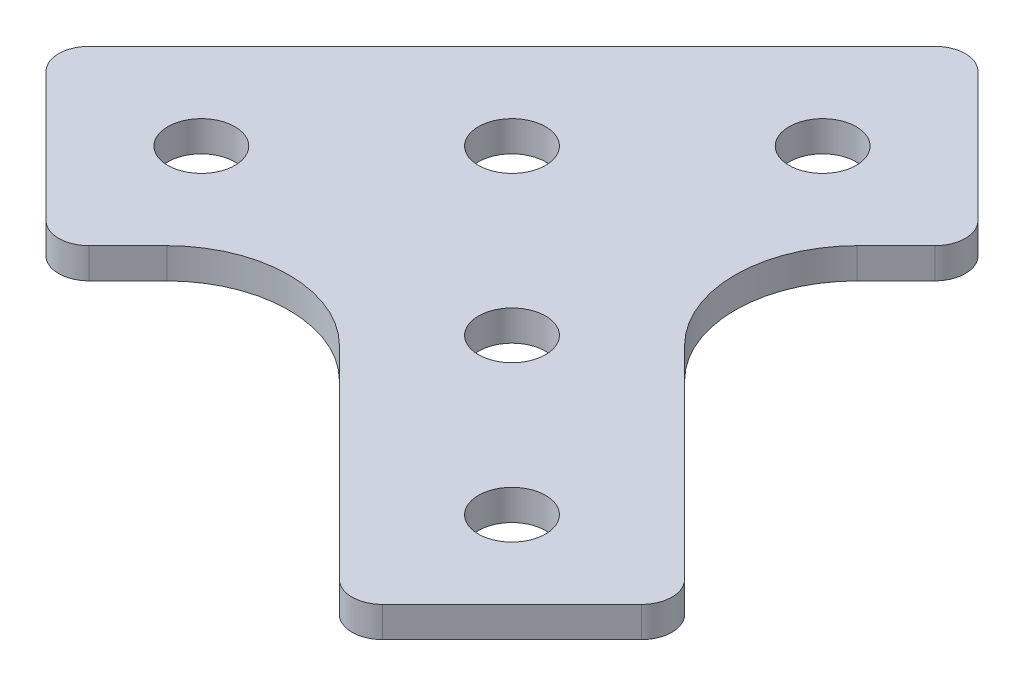
ISO-10303-21;
HEADER;
FILE_DESCRIPTION(('STEP AP214'),'2;1');
FILE_NAME('part.step','',(''),(''),'','','');
FILE_SCHEMA(('AUTOMOTIVE_DESIGN { 1 0 10303 214 1 1 1 1 }'));
ENDSEC;
DATA;
#1=APPLICATION_CONTEXT('core data for automotive mechanical design processes');
#2=APPLICATION_PROTOCOL_DEFINITION('international standard','automotive_design',2000,#1);
#3=PRODUCT_CONTEXT('',#1,'mechanical');
#4=PRODUCT('Part','Part','',(#3));
#5=PRODUCT_RELATED_PRODUCT_CATEGORY('part','',(#4));
#6=PRODUCT_DEFINITION_FORMATION('','',#4);
#7=PRODUCT_DEFINITION_CONTEXT('part definition',#1,'design');
#8=PRODUCT_DEFINITION('design','',#6,#7);
#9=PRODUCT_DEFINITION_SHAPE('','',#8);
#10=(LENGTH_UNIT() NAMED_UNIT(*) SI_UNIT(.MILLI.,.METRE.));
#11=(NAMED_UNIT(*) PLANE_ANGLE_UNIT() SI_UNIT($,.RADIAN.));
#12=(NAMED_UNIT(*) SI_UNIT($,.STERADIAN.) SOLID_ANGLE_UNIT());
#13=UNCERTAINTY_MEASURE_WITH_UNIT(LENGTH_MEASURE(1.E-05),#10,'distance_accuracy_value','');
#14=(GEOMETRIC_REPRESENTATION_CONTEXT(3) GLOBAL_UNCERTAINTY_ASSIGNED_CONTEXT((#13)) GLOBAL_UNIT_ASSIGNED_CONTEXT((#10,
#11,#12)) REPRESENTATION_CONTEXT('',''));
#15=CARTESIAN_POINT('',(0.,0.,0.));
#16=DIRECTION('',(0.,0.,1.));
#17=DIRECTION('',(1.,0.,0.));
#18=AXIS2_PLACEMENT_3D('',#15,#16,#17);
#19=CARTESIAN_POINT('',(0.,3.175,0.));
#20=DIRECTION('',(0.707106781186548,0.,0.707106781186547));
#21=DIRECTION('',(0.707106781186547,0.,-0.707106781186548));
#22=AXIS2_PLACEMENT_3D('',#19,#20,#21);
#23=PLANE('',#22);
#24=DIRECTION('',(-0.707106781186546,0.,0.707106781186548));
#25=VECTOR('',#24,1.);
#26=CARTESIAN_POINT('',(0.,3.175,0.));
#27=LINE('',#26,#25);
#28=CARTESIAN_POINT('',(-8.98025612106918,3.175,8.9802561210692));
#29=VERTEX_POINT('',#28);
#30=CARTESIAN_POINT('',(-13.0213713755503,3.175,13.0213713755503));
#31=VERTEX_POINT('',#30);
#32=EDGE_CURVE('E311',#29,#31,#27,.T.);
#33=ORIENTED_EDGE('',*,*,#32,.T.);
#34=DIRECTION('',(0.,1.,0.));
#35=VECTOR('',#34,1.);
#36=CARTESIAN_POINT('',(-13.0213713755503,3.175,13.0213713755504));
#37=LINE('',#36,#35);
#38=CARTESIAN_POINT('',(-13.0213713755503,0.,13.0213713755503));
#39=VERTEX_POINT('',#38);
#40=EDGE_CURVE('E11',#31,#39,#37,.F.);
#41=ORIENTED_EDGE('',*,*,#40,.T.);
#42=DIRECTION('',(-0.707106781186546,0.,0.707106781186548));
#43=VECTOR('',#42,1.);
#44=CARTESIAN_POINT('',(0.,0.,0.));
#45=LINE('',#44,#43);
#46=CARTESIAN_POINT('',(-8.98025612106918,0.,8.9802561210692));
#47=VERTEX_POINT('',#46);
#48=EDGE_CURVE('E328',#47,#39,#45,.T.);
#49=ORIENTED_EDGE('',*,*,#48,.F.);
#50=DIRECTION('',(0.,-1.,0.));
#51=VECTOR('',#50,1.);
#52=CARTESIAN_POINT('',(-8.98025612106918,3.175,8.98025612106921));
#53=LINE('',#52,#51);
#54=EDGE_CURVE('E204',#47,#29,#53,.F.);
#55=ORIENTED_EDGE('',*,*,#54,.T.);
#56=EDGE_LOOP('',(#33,#41,#49,#55));
#57=FACE_BOUND('',#56,.T.);
#58=ADVANCED_FACE('F44',(#57),#23,.T.);
#59=CARTESIAN_POINT('',(-17.9605122421382,3.175,-17.9605122421383));
#60=DIRECTION('',(-0.70710678118655,0.,-0.707106781186545));
#61=DIRECTION('',(-0.707106781186545,0.,0.70710678118655));
#62=AXIS2_PLACEMENT_3D('',#59,#60,#61);
#63=PLANE('',#62);
#64=DIRECTION('',(-0.707106781186547,0.,0.707106781186548));
#65=VECTOR('',#64,1.);
#66=CARTESIAN_POINT('',(-17.9605122421382,3.175,-17.9605122421383));
#67=LINE('',#66,#65);
#68=CARTESIAN_POINT('',(13.0213713755503,3.175,-48.9423958598269));
#69=VERTEX_POINT('',#68);
#70=CARTESIAN_POINT('',(-30.9818836176886,3.175,-4.93914086658794));
#71=VERTEX_POINT('',#70);
#72=EDGE_CURVE('E308',#69,#71,#67,.T.);
#73=ORIENTED_EDGE('',*,*,#72,.F.);
#74=DIRECTION('',(0.,1.,0.));
#75=VECTOR('',#74,1.);
#76=CARTESIAN_POINT('',(13.0213713755502,0.,-48.942395859827));
#77=LINE('',#76,#75);
#78=CARTESIAN_POINT('',(13.0213713755502,0.,-48.942395859827));
#79=VERTEX_POINT('',#78);
#80=EDGE_CURVE('E244',#69,#79,#77,.F.);
#81=ORIENTED_EDGE('',*,*,#80,.T.);
#82=DIRECTION('',(0.707106781186545,0.,-0.70710678118655));
#83=VECTOR('',#82,1.);
#84=CARTESIAN_POINT('',(-17.9605122421382,0.,-17.9605122421383));
#85=LINE('',#84,#83);
#86=CARTESIAN_POINT('',(-30.9818836176886,0.,-4.9391408665879));
#87=VERTEX_POINT('',#86);
#88=EDGE_CURVE('E198',#87,#79,#85,.T.);
#89=ORIENTED_EDGE('',*,*,#88,.F.);
#90=DIRECTION('',(0.,1.,0.));
#91=VECTOR('',#90,1.);
#92=CARTESIAN_POINT('',(-30.9818836176886,3.175,-4.9391408665879));
#93=LINE('',#92,#91);
#94=EDGE_CURVE('E240',#87,#71,#93,.T.);
#95=ORIENTED_EDGE('',*,*,#94,.T.);
#96=EDGE_LOOP('',(#73,#81,#89,#95));
#97=FACE_BOUND('',#96,.T.);
#98=ADVANCED_FACE('F307',(#97),#63,.T.);
#99=CARTESIAN_POINT('',(0.,3.175,0.));
#100=DIRECTION('',(0.,-1.,0.));
#101=DIRECTION('',(0.,0.,-1.));
#102=AXIS2_PLACEMENT_3D('',#99,#100,#101);
#103=PLANE('',#102);
#104=CARTESIAN_POINT('',(16.1644610179245,3.175,-34.1249732600627));
#105=DIRECTION('',(0.,-1.,0.));
#106=DIRECTION('',(1.,0.,0.));
#107=AXIS2_PLACEMENT_3D('',#104,#105,#106);
#108=CIRCLE('',#107,3.49250000000001);
#109=CARTESIAN_POINT('',(19.6569610179246,3.175,-34.1249732600627));
#110=VERTEX_POINT('',#109);
#111=EDGE_CURVE('E300',#110,#110,#108,.T.);
#112=ORIENTED_EDGE('',*,*,#111,.T.);
#113=EDGE_LOOP('',(#112));
#114=FACE_BOUND('',#113,.T.);
#115=CARTESIAN_POINT('',(17.0624866300314,3.175,-0.898025612106839));
#116=DIRECTION('',(0.,1.,0.));
#117=DIRECTION('',(0.,0.,1.));
#118=AXIS2_PLACEMENT_3D('',#115,#116,#117);
#119=CIRCLE('',#118,3.4925);
#120=CARTESIAN_POINT('',(17.0624866300314,3.175,2.59447438789316));
#121=VERTEX_POINT('',#120);
#122=EDGE_CURVE('E184',#121,#121,#119,.T.);
#123=ORIENTED_EDGE('',*,*,#122,.F.);
#124=EDGE_LOOP('',(#123));
#125=FACE_BOUND('',#124,.T.);
#126=CARTESIAN_POINT('',(33.2269476479558,3.175,15.2664354058177));
#127=DIRECTION('',(0.,1.,0.));
#128=DIRECTION('',(0.,0.,1.));
#129=AXIS2_PLACEMENT_3D('',#126,#127,#128);
#130=CIRCLE('',#129,3.4925);
#131=CARTESIAN_POINT('',(33.2269476479558,3.175,18.7589354058177));
#132=VERTEX_POINT('',#131);
#133=EDGE_CURVE('E390',#132,#132,#130,.T.);
#134=ORIENTED_EDGE('',*,*,#133,.F.);
#135=EDGE_LOOP('',(#134));
#136=FACE_BOUND('',#135,.T.);
#137=CARTESIAN_POINT('',(0.,3.175,-17.9605122421383));
#138=DIRECTION('',(0.,1.,0.));
#139=DIRECTION('',(0.,0.,1.));
#140=AXIS2_PLACEMENT_3D('',#137,#138,#139);
#141=CIRCLE('',#140,3.49250000000001);
#142=CARTESIAN_POINT('',(0.,3.175,-14.4680122421383));
#143=VERTEX_POINT('',#142);
#144=EDGE_CURVE('E320',#143,#143,#141,.T.);
#145=ORIENTED_EDGE('',*,*,#144,.F.);
#146=EDGE_LOOP('',(#145));
#147=FACE_BOUND('',#146,.T.);
#148=CARTESIAN_POINT('',(-16.1644610179244,3.175,-1.79605122421382));
#149=DIRECTION('',(0.,1.,0.));
#150=DIRECTION('',(0.,0.,1.));
#151=AXIS2_PLACEMENT_3D('',#148,#149,#150);
#152=CIRCLE('',#151,3.49250000000001);
#153=CARTESIAN_POINT('',(-16.1644610179244,3.175,1.69644877578618));
#154=VERTEX_POINT('',#153);
#155=EDGE_CURVE('E404',#154,#154,#152,.T.);
#156=ORIENTED_EDGE('',*,*,#155,.F.);
#157=EDGE_LOOP('',(#156));
#158=FACE_BOUND('',#157,.T.);
#159=DIRECTION('',(0.707106781186548,0.,0.707106781186548));
#160=VECTOR('',#159,1.);
#161=CARTESIAN_POINT('',(33.2269476479559,3.175,-33.2269476479559));
#162=LINE('',#161,#160);
#163=CARTESIAN_POINT('',(17.5114994360848,3.175,-48.942395859827));
#164=VERTEX_POINT('',#163);
#165=CARTESIAN_POINT('',(30.9818836176887,3.175,-35.4720116782231));
#166=VERTEX_POINT('',#165);
#167=EDGE_CURVE('E371',#164,#166,#162,.T.);
#168=ORIENTED_EDGE('',*,*,#167,.F.);
#169=CARTESIAN_POINT('',(15.2664354058175,3.175,-46.6973318295597));
#170=DIRECTION('',(0.,-1.,0.));
#171=DIRECTION('',(0.,0.,-1.));
#172=AXIS2_PLACEMENT_3D('',#169,#170,#171);
#173=CIRCLE('',#172,3.175);
#174=EDGE_CURVE('E237',#164,#69,#173,.F.);
#175=ORIENTED_EDGE('',*,*,#174,.T.);
#176=ORIENTED_EDGE('',*,*,#72,.T.);
#177=CARTESIAN_POINT('',(-28.7368195874213,3.175,-2.69407683632062));
#178=DIRECTION('',(0.,-1.,0.));
#179=DIRECTION('',(0.,0.,-1.));
#180=AXIS2_PLACEMENT_3D('',#177,#178,#179);
#181=CIRCLE('',#180,3.175);
#182=CARTESIAN_POINT('',(-30.9818836176886,3.175,-0.449012806053337));
#183=VERTEX_POINT('',#182);
#184=EDGE_CURVE('E225',#71,#183,#181,.F.);
#185=ORIENTED_EDGE('',*,*,#184,.T.);
#186=DIRECTION('',(0.707106781186547,0.,0.707106781186548));
#187=VECTOR('',#186,1.);
#188=CARTESIAN_POINT('',(-15.2664354058176,3.175,15.2664354058176));
#189=LINE('',#188,#187);
#190=CARTESIAN_POINT('',(-17.5114994360849,3.175,13.0213713755504));
#191=VERTEX_POINT('',#190);
#192=EDGE_CURVE('E291',#183,#191,#189,.T.);
#193=ORIENTED_EDGE('',*,*,#192,.T.);
#194=CARTESIAN_POINT('',(-15.2664354058176,3.175,10.7763073452831));
#195=DIRECTION('',(0.,-1.,0.));
#196=DIRECTION('',(0.,0.,-1.));
#197=AXIS2_PLACEMENT_3D('',#194,#195,#196);
#198=CIRCLE('',#197,3.175);
#199=EDGE_CURVE('E222',#191,#31,#198,.F.);
#200=ORIENTED_EDGE('',*,*,#199,.T.);
#201=ORIENTED_EDGE('',*,*,#32,.F.);
#202=CARTESIAN_POINT('',(0.,3.175,17.9605122421383));
#203=DIRECTION('',(0.,-1.,0.));
#204=DIRECTION('',(0.,0.,-1.));
#205=AXIS2_PLACEMENT_3D('',#202,#203,#204);
#206=CIRCLE('',#205,12.7);
#207=CARTESIAN_POINT('',(8.98025612106917,3.175,8.98025612106923));
#208=VERTEX_POINT('',#207);
#209=EDGE_CURVE('E211',#29,#208,#206,.T.);
#210=ORIENTED_EDGE('',*,*,#209,.T.);
#211=DIRECTION('',(-0.707106781186545,0.,-0.70710678118655));
#212=VECTOR('',#211,1.);
#213=CARTESIAN_POINT('',(32.3289220358488,3.175,32.3289220358491));
#214=LINE('',#213,#212);
#215=CARTESIAN_POINT('',(30.0838580055816,3.175,30.0838580055818));
#216=VERTEX_POINT('',#215);
#217=EDGE_CURVE('E316',#216,#208,#214,.T.);
#218=ORIENTED_EDGE('',*,*,#217,.F.);
#219=CARTESIAN_POINT('',(32.3289220358489,3.175,27.8387939753145));
#220=DIRECTION('',(0.,-1.,0.));
#221=DIRECTION('',(0.,0.,-1.));
#222=AXIS2_PLACEMENT_3D('',#219,#220,#221);
#223=CIRCLE('',#222,3.175);
#224=CARTESIAN_POINT('',(34.5739860661161,3.175,30.0838580055818));
#225=VERTEX_POINT('',#224);
#226=EDGE_CURVE('E228',#216,#225,#223,.F.);
#227=ORIENTED_EDGE('',*,*,#226,.T.);
#228=DIRECTION('',(0.70710678118655,0.,-0.707106781186545));
#229=VECTOR('',#228,1.);
#230=CARTESIAN_POINT('',(32.3289220358488,3.175,32.3289220358491));
#231=LINE('',#230,#229);
#232=CARTESIAN_POINT('',(48.04437024772,3.175,16.613473823978));
#233=VERTEX_POINT('',#232);
#234=EDGE_CURVE('E195',#225,#233,#231,.T.);
#235=ORIENTED_EDGE('',*,*,#234,.T.);
#236=CARTESIAN_POINT('',(45.7993062174527,3.175,14.3684097937108));
#237=DIRECTION('',(0.,-1.,0.));
#238=DIRECTION('',(0.,0.,-1.));
#239=AXIS2_PLACEMENT_3D('',#236,#237,#238);
#240=CIRCLE('',#239,3.175);
#241=CARTESIAN_POINT('',(48.0443702477199,3.175,12.1233457634435));
#242=VERTEX_POINT('',#241);
#243=EDGE_CURVE('E231',#233,#242,#240,.F.);
#244=ORIENTED_EDGE('',*,*,#243,.T.);
#245=DIRECTION('',(-0.707106781186545,0.,-0.70710678118655));
#246=VECTOR('',#245,1.);
#247=CARTESIAN_POINT('',(50.2894342779872,3.175,14.3684097937108));
#248=LINE('',#247,#246);
#249=CARTESIAN_POINT('',(26.9407683632075,3.175,-8.98025612106905));
#250=VERTEX_POINT('',#249);
#251=EDGE_CURVE('E165',#242,#250,#248,.T.);
#252=ORIENTED_EDGE('',*,*,#251,.T.);
#253=CARTESIAN_POINT('',(35.9210244842767,3.175,-17.9605122421382));
#254=DIRECTION('',(0.,-1.,0.));
#255=DIRECTION('',(0.,0.,-1.));
#256=AXIS2_PLACEMENT_3D('',#253,#254,#255);
#257=CIRCLE('',#256,12.7);
#258=CARTESIAN_POINT('',(26.9407683632076,3.175,-26.9407683632074));
#259=VERTEX_POINT('',#258);
#260=EDGE_CURVE('E159',#250,#259,#257,.T.);
#261=ORIENTED_EDGE('',*,*,#260,.T.);
#262=DIRECTION('',(0.707106781186551,0.,-0.707106781186544));
#263=VECTOR('',#262,1.);
#264=CARTESIAN_POINT('',(17.9605122421383,3.175,-17.9605122421382));
#265=LINE('',#264,#263);
#266=CARTESIAN_POINT('',(30.9818836176887,3.175,-30.9818836176885));
#267=VERTEX_POINT('',#266);
#268=EDGE_CURVE('E163',#259,#267,#265,.T.);
#269=ORIENTED_EDGE('',*,*,#268,.T.);
#270=CARTESIAN_POINT('',(28.7368195874214,3.175,-33.2269476479558));
#271=DIRECTION('',(0.,-1.,0.));
#272=DIRECTION('',(0.,0.,-1.));
#273=AXIS2_PLACEMENT_3D('',#270,#271,#272);
#274=CIRCLE('',#273,3.175);
#275=EDGE_CURVE('E234',#267,#166,#274,.F.);
#276=ORIENTED_EDGE('',*,*,#275,.T.);
#277=EDGE_LOOP('',(#168,#175,#176,#185,#193,#200,#201,#210,#218,#227,#235,#244,#252,#261,#269,#276));
#278=FACE_BOUND('',#277,.T.);
#279=ADVANCED_FACE('F162',(#114,#125,#136,#147,#158,#278),#103,.F.);
#280=CARTESIAN_POINT('',(0.,0.,0.));
#281=DIRECTION('',(0.,-1.,0.));
#282=DIRECTION('',(0.,0.,-1.));
#283=AXIS2_PLACEMENT_3D('',#280,#281,#282);
#284=PLANE('',#283);
#285=CARTESIAN_POINT('',(16.1644610179245,0.,-34.1249732600627));
#286=DIRECTION('',(0.,-1.,0.));
#287=DIRECTION('',(1.,0.,0.));
#288=AXIS2_PLACEMENT_3D('',#285,#286,#287);
#289=CIRCLE('',#288,3.49250000000001);
#290=CARTESIAN_POINT('',(19.6569610179246,0.,-34.1249732600627));
#291=VERTEX_POINT('',#290);
#292=EDGE_CURVE('E377',#291,#291,#289,.T.);
#293=ORIENTED_EDGE('',*,*,#292,.F.);
#294=EDGE_LOOP('',(#293));
#295=FACE_BOUND('',#294,.T.);
#296=CARTESIAN_POINT('',(17.0624866300314,0.,-0.898025612106839));
#297=DIRECTION('',(0.,1.,0.));
#298=DIRECTION('',(0.,0.,1.));
#299=AXIS2_PLACEMENT_3D('',#296,#297,#298);
#300=CIRCLE('',#299,3.4925);
#301=CARTESIAN_POINT('',(17.0624866300314,0.,2.59447438789316));
#302=VERTEX_POINT('',#301);
#303=EDGE_CURVE('E386',#302,#302,#300,.T.);
#304=ORIENTED_EDGE('',*,*,#303,.T.);
#305=EDGE_LOOP('',(#304));
#306=FACE_BOUND('',#305,.T.);
#307=CARTESIAN_POINT('',(33.2269476479558,0.,15.2664354058177));
#308=DIRECTION('',(0.,1.,0.));
#309=DIRECTION('',(0.,0.,1.));
#310=AXIS2_PLACEMENT_3D('',#307,#308,#309);
#311=CIRCLE('',#310,3.4925);
#312=CARTESIAN_POINT('',(33.2269476479558,0.,18.7589354058177));
#313=VERTEX_POINT('',#312);
#314=EDGE_CURVE('E394',#313,#313,#311,.T.);
#315=ORIENTED_EDGE('',*,*,#314,.T.);
#316=EDGE_LOOP('',(#315));
#317=FACE_BOUND('',#316,.T.);
#318=CARTESIAN_POINT('',(0.,0.,-17.9605122421383));
#319=DIRECTION('',(0.,1.,0.));
#320=DIRECTION('',(0.,0.,1.));
#321=AXIS2_PLACEMENT_3D('',#318,#319,#320);
#322=CIRCLE('',#321,3.49250000000001);
#323=CARTESIAN_POINT('',(0.,0.,-14.4680122421383));
#324=VERTEX_POINT('',#323);
#325=EDGE_CURVE('E407',#324,#324,#322,.T.);
#326=ORIENTED_EDGE('',*,*,#325,.T.);
#327=EDGE_LOOP('',(#326));
#328=FACE_BOUND('',#327,.T.);
#329=CARTESIAN_POINT('',(-16.1644610179244,0.,-1.79605122421382));
#330=DIRECTION('',(0.,1.,0.));
#331=DIRECTION('',(0.,0.,1.));
#332=AXIS2_PLACEMENT_3D('',#329,#330,#331);
#333=CIRCLE('',#332,3.49250000000001);
#334=CARTESIAN_POINT('',(-16.1644610179244,0.,1.69644877578618));
#335=VERTEX_POINT('',#334);
#336=EDGE_CURVE('E332',#335,#335,#333,.T.);
#337=ORIENTED_EDGE('',*,*,#336,.T.);
#338=EDGE_LOOP('',(#337));
#339=FACE_BOUND('',#338,.T.);
#340=ORIENTED_EDGE('',*,*,#88,.T.);
#341=CARTESIAN_POINT('',(15.2664354058175,0.,-46.6973318295597));
#342=DIRECTION('',(0.,-1.,0.));
#343=DIRECTION('',(0.,0.,-1.));
#344=AXIS2_PLACEMENT_3D('',#341,#342,#343);
#345=CIRCLE('',#344,3.175);
#346=CARTESIAN_POINT('',(17.5114994360848,0.,-48.942395859827));
#347=VERTEX_POINT('',#346);
#348=EDGE_CURVE('E260',#79,#347,#345,.T.);
#349=ORIENTED_EDGE('',*,*,#348,.T.);
#350=DIRECTION('',(0.707106781186548,0.,0.707106781186548));
#351=VECTOR('',#350,1.);
#352=CARTESIAN_POINT('',(33.2269476479559,0.,-33.2269476479559));
#353=LINE('',#352,#351);
#354=CARTESIAN_POINT('',(30.9818836176887,0.,-35.4720116782231));
#355=VERTEX_POINT('',#354);
#356=EDGE_CURVE('E367',#347,#355,#353,.T.);
#357=ORIENTED_EDGE('',*,*,#356,.T.);
#358=CARTESIAN_POINT('',(28.7368195874214,0.,-33.2269476479558));
#359=DIRECTION('',(0.,-1.,0.));
#360=DIRECTION('',(0.,0.,-1.));
#361=AXIS2_PLACEMENT_3D('',#358,#359,#360);
#362=CIRCLE('',#361,3.175);
#363=CARTESIAN_POINT('',(30.9818836176887,0.,-30.9818836176885));
#364=VERTEX_POINT('',#363);
#365=EDGE_CURVE('E257',#355,#364,#362,.T.);
#366=ORIENTED_EDGE('',*,*,#365,.T.);
#367=DIRECTION('',(0.707106781186551,0.,-0.707106781186544));
#368=VECTOR('',#367,1.);
#369=CARTESIAN_POINT('',(17.9605122421383,0.,-17.9605122421382));
#370=LINE('',#369,#368);
#371=CARTESIAN_POINT('',(26.9407683632076,0.,-26.9407683632074));
#372=VERTEX_POINT('',#371);
#373=EDGE_CURVE('E185',#372,#364,#370,.T.);
#374=ORIENTED_EDGE('',*,*,#373,.F.);
#375=CARTESIAN_POINT('',(35.9210244842767,0.,-17.9605122421382));
#376=DIRECTION('',(0.,-1.,0.));
#377=DIRECTION('',(0.,0.,-1.));
#378=AXIS2_PLACEMENT_3D('',#375,#376,#377);
#379=CIRCLE('',#378,12.7);
#380=CARTESIAN_POINT('',(26.9407683632075,0.,-8.98025612106907));
#381=VERTEX_POINT('',#380);
#382=EDGE_CURVE('E172',#372,#381,#379,.F.);
#383=ORIENTED_EDGE('',*,*,#382,.T.);
#384=DIRECTION('',(0.707106781186546,0.,0.707106781186549));
#385=VECTOR('',#384,1.);
#386=CARTESIAN_POINT('',(0.,0.,-35.9210244842767));
#387=LINE('',#386,#385);
#388=CARTESIAN_POINT('',(48.04437024772,0.,12.1233457634435));
#389=VERTEX_POINT('',#388);
#390=EDGE_CURVE('E318',#381,#389,#387,.T.);
#391=ORIENTED_EDGE('',*,*,#390,.T.);
#392=CARTESIAN_POINT('',(45.7993062174527,0.,14.3684097937108));
#393=DIRECTION('',(0.,-1.,0.));
#394=DIRECTION('',(0.,0.,-1.));
#395=AXIS2_PLACEMENT_3D('',#392,#393,#394);
#396=CIRCLE('',#395,3.175);
#397=CARTESIAN_POINT('',(48.04437024772,0.,16.613473823978));
#398=VERTEX_POINT('',#397);
#399=EDGE_CURVE('E60',#389,#398,#396,.T.);
#400=ORIENTED_EDGE('',*,*,#399,.T.);
#401=DIRECTION('',(0.70710678118655,0.,-0.707106781186545));
#402=VECTOR('',#401,1.);
#403=CARTESIAN_POINT('',(32.3289220358488,0.,32.3289220358491));
#404=LINE('',#403,#402);
#405=CARTESIAN_POINT('',(34.5739860661161,0.,30.0838580055818));
#406=VERTEX_POINT('',#405);
#407=EDGE_CURVE('E335',#406,#398,#404,.T.);
#408=ORIENTED_EDGE('',*,*,#407,.F.);
#409=CARTESIAN_POINT('',(32.3289220358489,0.,27.8387939753145));
#410=DIRECTION('',(0.,-1.,0.));
#411=DIRECTION('',(0.,0.,-1.));
#412=AXIS2_PLACEMENT_3D('',#409,#410,#411);
#413=CIRCLE('',#412,3.175);
#414=CARTESIAN_POINT('',(30.0838580055816,0.,30.0838580055818));
#415=VERTEX_POINT('',#414);
#416=EDGE_CURVE('E68',#406,#415,#413,.T.);
#417=ORIENTED_EDGE('',*,*,#416,.T.);
#418=DIRECTION('',(-0.707106781186545,0.,-0.70710678118655));
#419=VECTOR('',#418,1.);
#420=CARTESIAN_POINT('',(32.3289220358488,0.,32.3289220358491));
#421=LINE('',#420,#419);
#422=CARTESIAN_POINT('',(8.98025612106917,0.,8.98025612106923));
#423=VERTEX_POINT('',#422);
#424=EDGE_CURVE('E331',#415,#423,#421,.T.);
#425=ORIENTED_EDGE('',*,*,#424,.T.);
#426=CARTESIAN_POINT('',(0.,0.,17.9605122421383));
#427=DIRECTION('',(0.,-1.,0.));
#428=DIRECTION('',(0.,0.,-1.));
#429=AXIS2_PLACEMENT_3D('',#426,#427,#428);
#430=CIRCLE('',#429,12.7);
#431=EDGE_CURVE('E171',#423,#47,#430,.F.);
#432=ORIENTED_EDGE('',*,*,#431,.T.);
#433=ORIENTED_EDGE('',*,*,#48,.T.);
#434=CARTESIAN_POINT('',(-15.2664354058176,0.,10.7763073452831));
#435=DIRECTION('',(0.,-1.,0.));
#436=DIRECTION('',(0.,0.,-1.));
#437=AXIS2_PLACEMENT_3D('',#434,#435,#436);
#438=CIRCLE('',#437,3.175);
#439=CARTESIAN_POINT('',(-17.5114994360849,0.,13.0213713755504));
#440=VERTEX_POINT('',#439);
#441=EDGE_CURVE('E247',#39,#440,#438,.T.);
#442=ORIENTED_EDGE('',*,*,#441,.T.);
#443=DIRECTION('',(0.707106781186547,0.,0.707106781186548));
#444=VECTOR('',#443,1.);
#445=CARTESIAN_POINT('',(-15.2664354058176,0.,15.2664354058176));
#446=LINE('',#445,#444);
#447=CARTESIAN_POINT('',(-30.9818836176886,0.,-0.449012806053337));
#448=VERTEX_POINT('',#447);
#449=EDGE_CURVE('E288',#448,#440,#446,.T.);
#450=ORIENTED_EDGE('',*,*,#449,.F.);
#451=CARTESIAN_POINT('',(-28.7368195874213,0.,-2.69407683632062));
#452=DIRECTION('',(0.,-1.,0.));
#453=DIRECTION('',(0.,0.,-1.));
#454=AXIS2_PLACEMENT_3D('',#451,#452,#453);
#455=CIRCLE('',#454,3.175);
#456=EDGE_CURVE('E250',#448,#87,#455,.T.);
#457=ORIENTED_EDGE('',*,*,#456,.T.);
#458=EDGE_LOOP('',(#340,#349,#357,#366,#374,#383,#391,#400,#408,#417,#425,#432,#433,#442,#450,#457));
#459=FACE_BOUND('',#458,.T.);
#460=ADVANCED_FACE('F295',(#295,#306,#317,#328,#339,#459),#284,.T.);
#461=CARTESIAN_POINT('',(32.3289220358488,3.175,32.3289220358491));
#462=DIRECTION('',(-0.70710678118655,0.,0.707106781186545));
#463=DIRECTION('',(0.707106781186545,0.,0.70710678118655));
#464=AXIS2_PLACEMENT_3D('',#461,#462,#463);
#465=PLANE('',#464);
#466=ORIENTED_EDGE('',*,*,#424,.F.);
#467=DIRECTION('',(0.,-1.,0.));
#468=VECTOR('',#467,1.);
#469=CARTESIAN_POINT('',(30.0838580055816,3.175,30.0838580055818));
#470=LINE('',#469,#468);
#471=EDGE_CURVE('E275',#415,#216,#470,.F.);
#472=ORIENTED_EDGE('',*,*,#471,.T.);
#473=ORIENTED_EDGE('',*,*,#217,.T.);
#474=DIRECTION('',(0.,-1.,0.));
#475=VECTOR('',#474,1.);
#476=CARTESIAN_POINT('',(8.98025612106916,0.,8.98025612106922));
#477=LINE('',#476,#475);
#478=EDGE_CURVE('E193',#208,#423,#477,.T.);
#479=ORIENTED_EDGE('',*,*,#478,.T.);
#480=EDGE_LOOP('',(#466,#472,#473,#479));
#481=FACE_BOUND('',#480,.T.);
#482=ADVANCED_FACE('F355',(#481),#465,.T.);
#483=CARTESIAN_POINT('',(32.3289220358488,3.175,32.3289220358491));
#484=DIRECTION('',(-0.707106781186545,0.,-0.70710678118655));
#485=DIRECTION('',(-0.70710678118655,0.,0.707106781186545));
#486=AXIS2_PLACEMENT_3D('',#483,#484,#485);
#487=PLANE('',#486);
#488=ORIENTED_EDGE('',*,*,#407,.T.);
#489=DIRECTION('',(0.,-1.,0.));
#490=VECTOR('',#489,1.);
#491=CARTESIAN_POINT('',(48.04437024772,3.175,16.6134738239781));
#492=LINE('',#491,#490);
#493=EDGE_CURVE('E272',#398,#233,#492,.F.);
#494=ORIENTED_EDGE('',*,*,#493,.T.);
#495=ORIENTED_EDGE('',*,*,#234,.F.);
#496=DIRECTION('',(0.,-1.,0.));
#497=VECTOR('',#496,1.);
#498=CARTESIAN_POINT('',(34.5739860661161,0.,30.0838580055818));
#499=LINE('',#498,#497);
#500=EDGE_CURVE('E269',#225,#406,#499,.T.);
#501=ORIENTED_EDGE('',*,*,#500,.T.);
#502=EDGE_LOOP('',(#488,#494,#495,#501));
#503=FACE_BOUND('',#502,.T.);
#504=ADVANCED_FACE('F348',(#503),#487,.F.);
#505=CARTESIAN_POINT('',(0.,3.175,-35.9210244842767));
#506=DIRECTION('',(0.707106781186549,0.,-0.707106781186546));
#507=DIRECTION('',(-0.707106781186546,0.,-0.707106781186549));
#508=AXIS2_PLACEMENT_3D('',#505,#506,#507);
#509=PLANE('',#508);
#510=ORIENTED_EDGE('',*,*,#251,.F.);
#511=DIRECTION('',(0.,-1.,0.));
#512=VECTOR('',#511,1.);
#513=CARTESIAN_POINT('',(48.04437024772,0.,12.1233457634435));
#514=LINE('',#513,#512);
#515=EDGE_CURVE('E265',#242,#389,#514,.T.);
#516=ORIENTED_EDGE('',*,*,#515,.T.);
#517=ORIENTED_EDGE('',*,*,#390,.F.);
#518=DIRECTION('',(0.,-1.,0.));
#519=VECTOR('',#518,1.);
#520=CARTESIAN_POINT('',(26.9407683632075,3.175,-8.98025612106907));
#521=LINE('',#520,#519);
#522=EDGE_CURVE('E189',#381,#250,#521,.F.);
#523=ORIENTED_EDGE('',*,*,#522,.T.);
#524=EDGE_LOOP('',(#510,#516,#517,#523));
#525=FACE_BOUND('',#524,.T.);
#526=ADVANCED_FACE('F340',(#525),#509,.T.);
#527=CARTESIAN_POINT('',(0.,0.,-17.9605122421383));
#528=DIRECTION('',(0.,1.,0.));
#529=DIRECTION('',(0.,0.,1.));
#530=AXIS2_PLACEMENT_3D('',#527,#528,#529);
#531=CYLINDRICAL_SURFACE('',#530,3.49250000000001);
#532=ORIENTED_EDGE('',*,*,#325,.F.);
#533=EDGE_LOOP('',(#532));
#534=FACE_BOUND('',#533,.T.);
#535=ORIENTED_EDGE('',*,*,#144,.T.);
#536=EDGE_LOOP('',(#535));
#537=FACE_BOUND('',#536,.T.);
#538=ADVANCED_FACE('F416',(#534,#537),#531,.F.);
#539=CARTESIAN_POINT('',(-16.1644610179244,0.,-1.79605122421382));
#540=DIRECTION('',(0.,1.,0.));
#541=DIRECTION('',(0.,0.,1.));
#542=AXIS2_PLACEMENT_3D('',#539,#540,#541);
#543=CYLINDRICAL_SURFACE('',#542,3.49250000000001);
#544=ORIENTED_EDGE('',*,*,#336,.F.);
#545=EDGE_LOOP('',(#544));
#546=FACE_BOUND('',#545,.T.);
#547=ORIENTED_EDGE('',*,*,#155,.T.);
#548=EDGE_LOOP('',(#547));
#549=FACE_BOUND('',#548,.T.);
#550=ADVANCED_FACE('F424',(#546,#549),#543,.F.);
#551=CARTESIAN_POINT('',(33.2269476479558,0.,15.2664354058177));
#552=DIRECTION('',(0.,1.,0.));
#553=DIRECTION('',(0.,0.,1.));
#554=AXIS2_PLACEMENT_3D('',#551,#552,#553);
#555=CYLINDRICAL_SURFACE('',#554,3.4925);
#556=ORIENTED_EDGE('',*,*,#314,.F.);
#557=EDGE_LOOP('',(#556));
#558=FACE_BOUND('',#557,.T.);
#559=ORIENTED_EDGE('',*,*,#133,.T.);
#560=EDGE_LOOP('',(#559));
#561=FACE_BOUND('',#560,.T.);
#562=ADVANCED_FACE('F426',(#558,#561),#555,.F.);
#563=CARTESIAN_POINT('',(17.0624866300314,0.,-0.898025612106839));
#564=DIRECTION('',(0.,1.,0.));
#565=DIRECTION('',(0.,0.,1.));
#566=AXIS2_PLACEMENT_3D('',#563,#564,#565);
#567=CYLINDRICAL_SURFACE('',#566,3.4925);
#568=ORIENTED_EDGE('',*,*,#303,.F.);
#569=EDGE_LOOP('',(#568));
#570=FACE_BOUND('',#569,.T.);
#571=ORIENTED_EDGE('',*,*,#122,.T.);
#572=EDGE_LOOP('',(#571));
#573=FACE_BOUND('',#572,.T.);
#574=ADVANCED_FACE('F433',(#570,#573),#567,.F.);
#575=CARTESIAN_POINT('',(17.9605122421383,3.175,-17.9605122421382));
#576=DIRECTION('',(0.707106781186544,0.,0.707106781186551));
#577=DIRECTION('',(-0.707106781186551,0.,0.707106781186544));
#578=AXIS2_PLACEMENT_3D('',#575,#576,#577);
#579=PLANE('',#578);
#580=ORIENTED_EDGE('',*,*,#373,.T.);
#581=DIRECTION('',(0.,1.,0.));
#582=VECTOR('',#581,1.);
#583=CARTESIAN_POINT('',(30.9818836176887,3.175,-30.9818836176885));
#584=LINE('',#583,#582);
#585=EDGE_CURVE('E182',#364,#267,#584,.T.);
#586=ORIENTED_EDGE('',*,*,#585,.T.);
#587=ORIENTED_EDGE('',*,*,#268,.F.);
#588=DIRECTION('',(0.,-1.,0.));
#589=VECTOR('',#588,1.);
#590=CARTESIAN_POINT('',(26.9407683632076,0.,-26.9407683632074));
#591=LINE('',#590,#589);
#592=EDGE_CURVE('E179',#259,#372,#591,.T.);
#593=ORIENTED_EDGE('',*,*,#592,.T.);
#594=EDGE_LOOP('',(#580,#586,#587,#593));
#595=FACE_BOUND('',#594,.T.);
#596=ADVANCED_FACE('F178',(#595),#579,.T.);
#597=CARTESIAN_POINT('',(16.1644610179245,0.,-34.1249732600627));
#598=DIRECTION('',(0.,1.,0.));
#599=DIRECTION('',(1.,0.,0.));
#600=AXIS2_PLACEMENT_3D('',#597,#598,#599);
#601=CYLINDRICAL_SURFACE('',#600,3.49250000000001);
#602=ORIENTED_EDGE('',*,*,#292,.T.);
#603=EDGE_LOOP('',(#602));
#604=FACE_BOUND('',#603,.T.);
#605=ORIENTED_EDGE('',*,*,#111,.F.);
#606=EDGE_LOOP('',(#605));
#607=FACE_BOUND('',#606,.T.);
#608=ADVANCED_FACE('F524',(#604,#607),#601,.F.);
#609=CARTESIAN_POINT('',(33.2269476479559,0.,-33.2269476479559));
#610=DIRECTION('',(-0.707106781186548,0.,0.707106781186548));
#611=DIRECTION('',(0.707106781186548,0.,0.707106781186548));
#612=AXIS2_PLACEMENT_3D('',#609,#610,#611);
#613=PLANE('',#612);
#614=ORIENTED_EDGE('',*,*,#356,.F.);
#615=DIRECTION('',(0.,1.,0.));
#616=VECTOR('',#615,1.);
#617=CARTESIAN_POINT('',(17.5114994360848,3.175,-48.942395859827));
#618=LINE('',#617,#616);
#619=EDGE_CURVE('E218',#347,#164,#618,.T.);
#620=ORIENTED_EDGE('',*,*,#619,.T.);
#621=ORIENTED_EDGE('',*,*,#167,.T.);
#622=DIRECTION('',(0.,1.,0.));
#623=VECTOR('',#622,1.);
#624=CARTESIAN_POINT('',(30.9818836176887,0.,-35.4720116782231));
#625=LINE('',#624,#623);
#626=EDGE_CURVE('E215',#166,#355,#625,.F.);
#627=ORIENTED_EDGE('',*,*,#626,.T.);
#628=EDGE_LOOP('',(#614,#620,#621,#627));
#629=FACE_BOUND('',#628,.T.);
#630=ADVANCED_FACE('F513',(#629),#613,.F.);
#631=CARTESIAN_POINT('',(-15.2664354058176,0.,15.2664354058176));
#632=DIRECTION('',(-0.707106781186548,0.,0.707106781186547));
#633=DIRECTION('',(0.707106781186547,0.,0.707106781186548));
#634=AXIS2_PLACEMENT_3D('',#631,#632,#633);
#635=PLANE('',#634);
#636=ORIENTED_EDGE('',*,*,#192,.F.);
#637=DIRECTION('',(0.,1.,0.));
#638=VECTOR('',#637,1.);
#639=CARTESIAN_POINT('',(-30.9818836176886,0.,-0.44901280605333));
#640=LINE('',#639,#638);
#641=EDGE_CURVE('E53',#183,#448,#640,.F.);
#642=ORIENTED_EDGE('',*,*,#641,.T.);
#643=ORIENTED_EDGE('',*,*,#449,.T.);
#644=DIRECTION('',(0.,1.,0.));
#645=VECTOR('',#644,1.);
#646=CARTESIAN_POINT('',(-17.5114994360849,0.,13.0213713755504));
#647=LINE('',#646,#645);
#648=EDGE_CURVE('E278',#440,#191,#647,.T.);
#649=ORIENTED_EDGE('',*,*,#648,.T.);
#650=EDGE_LOOP('',(#636,#642,#643,#649));
#651=FACE_BOUND('',#650,.T.);
#652=ADVANCED_FACE('F287',(#651),#635,.T.);
#653=CARTESIAN_POINT('',(35.9210244842767,3.175,-17.9605122421382));
#654=DIRECTION('',(0.,1.,0.));
#655=DIRECTION('',(0.,0.,1.));
#656=AXIS2_PLACEMENT_3D('',#653,#654,#655);
#657=CYLINDRICAL_SURFACE('',#656,12.7);
#658=ORIENTED_EDGE('',*,*,#260,.F.);
#659=ORIENTED_EDGE('',*,*,#522,.F.);
#660=ORIENTED_EDGE('',*,*,#382,.F.);
#661=ORIENTED_EDGE('',*,*,#592,.F.);
#662=EDGE_LOOP('',(#658,#659,#660,#661));
#663=FACE_BOUND('',#662,.T.);
#664=ADVANCED_FACE('F187',(#663),#657,.F.);
#665=CARTESIAN_POINT('',(0.,3.175,17.9605122421383));
#666=DIRECTION('',(0.,1.,0.));
#667=DIRECTION('',(0.,0.,1.));
#668=AXIS2_PLACEMENT_3D('',#665,#666,#667);
#669=CYLINDRICAL_SURFACE('',#668,12.7);
#670=ORIENTED_EDGE('',*,*,#209,.F.);
#671=ORIENTED_EDGE('',*,*,#54,.F.);
#672=ORIENTED_EDGE('',*,*,#431,.F.);
#673=ORIENTED_EDGE('',*,*,#478,.F.);
#674=EDGE_LOOP('',(#670,#671,#672,#673));
#675=FACE_BOUND('',#674,.T.);
#676=ADVANCED_FACE('F359',(#675),#669,.F.);
#677=CARTESIAN_POINT('',(15.2664354058175,0.,-46.6973318295597));
#678=DIRECTION('',(0.,-1.,0.));
#679=DIRECTION('',(0.,0.,-1.));
#680=AXIS2_PLACEMENT_3D('',#677,#678,#679);
#681=CYLINDRICAL_SURFACE('',#680,3.175);
#682=ORIENTED_EDGE('',*,*,#348,.F.);
#683=ORIENTED_EDGE('',*,*,#80,.F.);
#684=ORIENTED_EDGE('',*,*,#174,.F.);
#685=ORIENTED_EDGE('',*,*,#619,.F.);
#686=EDGE_LOOP('',(#682,#683,#684,#685));
#687=FACE_BOUND('',#686,.T.);
#688=ADVANCED_FACE('F452',(#687),#681,.T.);
#689=CARTESIAN_POINT('',(28.7368195874214,3.175,-33.2269476479558));
#690=DIRECTION('',(0.,-1.,0.));
#691=DIRECTION('',(0.,0.,-1.));
#692=AXIS2_PLACEMENT_3D('',#689,#690,#691);
#693=CYLINDRICAL_SURFACE('',#692,3.175);
#694=ORIENTED_EDGE('',*,*,#365,.F.);
#695=ORIENTED_EDGE('',*,*,#626,.F.);
#696=ORIENTED_EDGE('',*,*,#275,.F.);
#697=ORIENTED_EDGE('',*,*,#585,.F.);
#698=EDGE_LOOP('',(#694,#695,#696,#697));
#699=FACE_BOUND('',#698,.T.);
#700=ADVANCED_FACE('F455',(#699),#693,.T.);
#701=CARTESIAN_POINT('',(45.7993062174527,3.175,14.3684097937108));
#702=DIRECTION('',(0.,1.,0.));
#703=DIRECTION('',(0.,0.,1.));
#704=AXIS2_PLACEMENT_3D('',#701,#702,#703);
#705=CYLINDRICAL_SURFACE('',#704,3.175);
#706=ORIENTED_EDGE('',*,*,#243,.F.);
#707=ORIENTED_EDGE('',*,*,#493,.F.);
#708=ORIENTED_EDGE('',*,*,#399,.F.);
#709=ORIENTED_EDGE('',*,*,#515,.F.);
#710=EDGE_LOOP('',(#706,#707,#708,#709));
#711=FACE_BOUND('',#710,.T.);
#712=ADVANCED_FACE('F344',(#711),#705,.T.);
#713=CARTESIAN_POINT('',(32.3289220358489,3.175,27.8387939753145));
#714=DIRECTION('',(0.,1.,0.));
#715=DIRECTION('',(0.,0.,1.));
#716=AXIS2_PLACEMENT_3D('',#713,#714,#715);
#717=CYLINDRICAL_SURFACE('',#716,3.175);
#718=ORIENTED_EDGE('',*,*,#226,.F.);
#719=ORIENTED_EDGE('',*,*,#471,.F.);
#720=ORIENTED_EDGE('',*,*,#416,.F.);
#721=ORIENTED_EDGE('',*,*,#500,.F.);
#722=EDGE_LOOP('',(#718,#719,#720,#721));
#723=FACE_BOUND('',#722,.T.);
#724=ADVANCED_FACE('F351',(#723),#717,.T.);
#725=CARTESIAN_POINT('',(-28.7368195874213,3.175,-2.69407683632062));
#726=DIRECTION('',(0.,1.,0.));
#727=DIRECTION('',(0.,0.,1.));
#728=AXIS2_PLACEMENT_3D('',#725,#726,#727);
#729=CYLINDRICAL_SURFACE('',#728,3.175);
#730=ORIENTED_EDGE('',*,*,#456,.F.);
#731=ORIENTED_EDGE('',*,*,#641,.F.);
#732=ORIENTED_EDGE('',*,*,#184,.F.);
#733=ORIENTED_EDGE('',*,*,#94,.F.);
#734=EDGE_LOOP('',(#730,#731,#732,#733));
#735=FACE_BOUND('',#734,.T.);
#736=ADVANCED_FACE('F303',(#735),#729,.T.);
#737=CARTESIAN_POINT('',(-15.2664354058176,0.,10.7763073452831));
#738=DIRECTION('',(0.,1.,0.));
#739=DIRECTION('',(0.,0.,1.));
#740=AXIS2_PLACEMENT_3D('',#737,#738,#739);
#741=CYLINDRICAL_SURFACE('',#740,3.175);
#742=ORIENTED_EDGE('',*,*,#441,.F.);
#743=ORIENTED_EDGE('',*,*,#40,.F.);
#744=ORIENTED_EDGE('',*,*,#199,.F.);
#745=ORIENTED_EDGE('',*,*,#648,.F.);
#746=EDGE_LOOP('',(#742,#743,#744,#745));
#747=FACE_BOUND('',#746,.T.);
#748=ADVANCED_FACE('F46',(#747),#741,.T.);
#749=CLOSED_SHELL('',(#58,#98,#279,#460,#482,#504,#526,#538,#550,#562,#574,#596,#608,#630,#652,
#664,#676,#688,#700,#712,#724,#736,#748));
#750=MANIFOLD_SOLID_BREP('B2',#749);
#751=ADVANCED_BREP_SHAPE_REPRESENTATION('',(#18,#750),#14);
#752=SHAPE_DEFINITION_REPRESENTATION(#9,#751);
ENDSEC;
END-ISO-10303-21;
